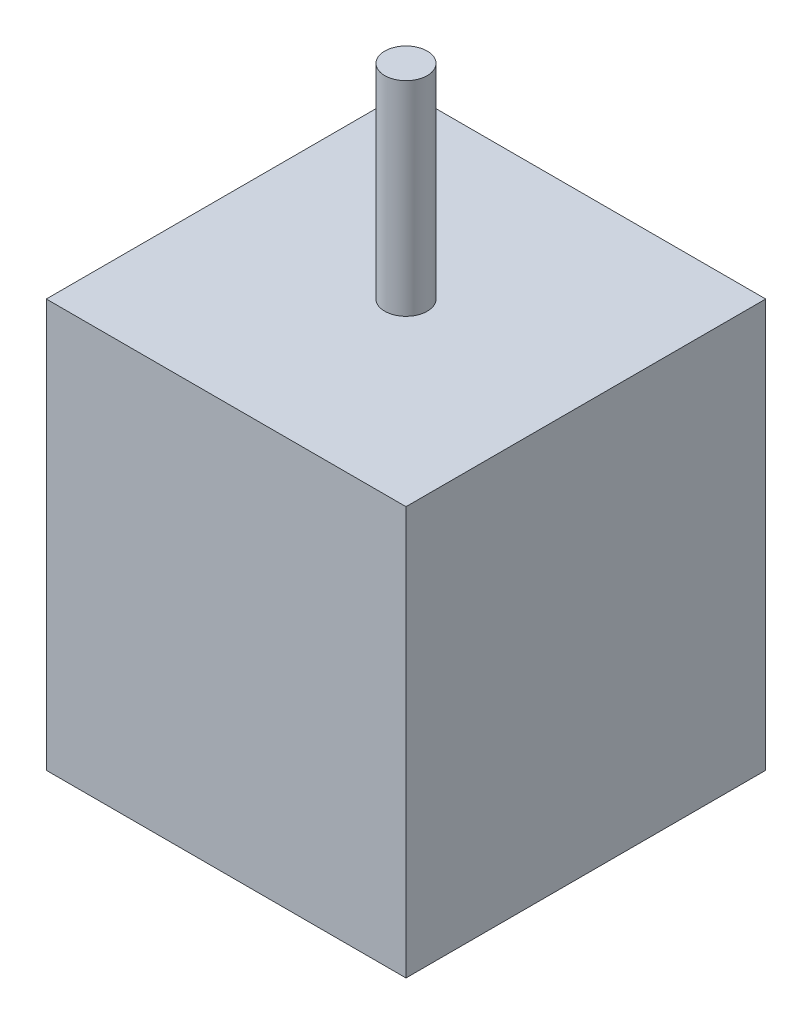
ISO-10303-21;
HEADER;
FILE_DESCRIPTION(('STEP AP214'),'2;1');
FILE_NAME('part.step','',(''),(''),'','','');
FILE_SCHEMA(('AUTOMOTIVE_DESIGN { 1 0 10303 214 1 1 1 1 }'));
ENDSEC;
DATA;
#1=APPLICATION_CONTEXT('core data for automotive mechanical design processes');
#2=APPLICATION_PROTOCOL_DEFINITION('international standard','automotive_design',2000,#1);
#3=PRODUCT_CONTEXT('',#1,'mechanical');
#4=PRODUCT('Part','Part','',(#3));
#5=PRODUCT_RELATED_PRODUCT_CATEGORY('part','',(#4));
#6=PRODUCT_DEFINITION_FORMATION('','',#4);
#7=PRODUCT_DEFINITION_CONTEXT('part definition',#1,'design');
#8=PRODUCT_DEFINITION('design','',#6,#7);
#9=PRODUCT_DEFINITION_SHAPE('','',#8);
#10=(LENGTH_UNIT() NAMED_UNIT(*) SI_UNIT(.MILLI.,.METRE.));
#11=(NAMED_UNIT(*) PLANE_ANGLE_UNIT() SI_UNIT($,.RADIAN.));
#12=(NAMED_UNIT(*) SI_UNIT($,.STERADIAN.) SOLID_ANGLE_UNIT());
#13=UNCERTAINTY_MEASURE_WITH_UNIT(LENGTH_MEASURE(1.E-05),#10,'distance_accuracy_value','');
#14=(GEOMETRIC_REPRESENTATION_CONTEXT(3) GLOBAL_UNCERTAINTY_ASSIGNED_CONTEXT((#13)) GLOBAL_UNIT_ASSIGNED_CONTEXT((#10,
#11,#12)) REPRESENTATION_CONTEXT('',''));
#15=CARTESIAN_POINT('',(0.,0.,0.));
#16=DIRECTION('',(0.,0.,1.));
#17=DIRECTION('',(1.,0.,0.));
#18=AXIS2_PLACEMENT_3D('',#15,#16,#17);
#19=CARTESIAN_POINT('',(0.,24.,0.));
#20=DIRECTION('',(0.,-1.,0.));
#21=DIRECTION('',(0.,0.,-1.));
#22=AXIS2_PLACEMENT_3D('',#19,#20,#21);
#23=CYLINDRICAL_SURFACE('',#22,2.5);
#24=CARTESIAN_POINT('',(0.,24.,0.));
#25=DIRECTION('',(0.,1.,0.));
#26=DIRECTION('',(0.,0.,1.));
#27=AXIS2_PLACEMENT_3D('',#24,#25,#26);
#28=CIRCLE('',#27,2.5);
#29=CARTESIAN_POINT('',(0.,24.,2.5));
#30=VERTEX_POINT('',#29);
#31=EDGE_CURVE('E11',#30,#30,#28,.T.);
#32=ORIENTED_EDGE('',*,*,#31,.F.);
#33=EDGE_LOOP('',(#32));
#34=FACE_BOUND('',#33,.T.);
#35=CARTESIAN_POINT('',(0.,0.,0.));
#36=DIRECTION('',(0.,-1.,0.));
#37=DIRECTION('',(0.,0.,-1.));
#38=AXIS2_PLACEMENT_3D('',#35,#36,#37);
#39=CIRCLE('',#38,2.5);
#40=CARTESIAN_POINT('',(0.,0.,-2.5));
#41=VERTEX_POINT('',#40);
#42=EDGE_CURVE('E40',#41,#41,#39,.T.);
#43=ORIENTED_EDGE('',*,*,#42,.F.);
#44=EDGE_LOOP('',(#43));
#45=FACE_BOUND('',#44,.T.);
#46=ADVANCED_FACE('F32',(#34,#45),#23,.T.);
#47=CARTESIAN_POINT('',(0.,24.,0.));
#48=DIRECTION('',(0.,1.,0.));
#49=DIRECTION('',(0.,0.,1.));
#50=AXIS2_PLACEMENT_3D('',#47,#48,#49);
#51=PLANE('',#50);
#52=ORIENTED_EDGE('',*,*,#31,.T.);
#53=EDGE_LOOP('',(#52));
#54=FACE_BOUND('',#53,.T.);
#55=ADVANCED_FACE('F116',(#54),#51,.T.);
#56=CARTESIAN_POINT('',(21.15,-48.,21.15));
#57=DIRECTION('',(1.,0.,0.));
#58=DIRECTION('',(0.,0.,-1.));
#59=AXIS2_PLACEMENT_3D('',#56,#57,#58);
#60=PLANE('',#59);
#61=DIRECTION('',(0.,0.,-1.));
#62=VECTOR('',#61,1.);
#63=CARTESIAN_POINT('',(21.15,0.,21.15));
#64=LINE('',#63,#62);
#65=CARTESIAN_POINT('',(21.15,0.,21.15));
#66=VERTEX_POINT('',#65);
#67=CARTESIAN_POINT('',(21.15,0.,-21.15));
#68=VERTEX_POINT('',#67);
#69=EDGE_CURVE('E99',#66,#68,#64,.T.);
#70=ORIENTED_EDGE('',*,*,#69,.F.);
#71=DIRECTION('',(0.,1.,0.));
#72=VECTOR('',#71,1.);
#73=CARTESIAN_POINT('',(21.15,-48.,21.15));
#74=LINE('',#73,#72);
#75=CARTESIAN_POINT('',(21.15,-48.,21.15));
#76=VERTEX_POINT('',#75);
#77=EDGE_CURVE('E48',#76,#66,#74,.T.);
#78=ORIENTED_EDGE('',*,*,#77,.F.);
#79=DIRECTION('',(0.,0.,-1.));
#80=VECTOR('',#79,1.);
#81=CARTESIAN_POINT('',(21.15,-48.,21.15));
#82=LINE('',#81,#80);
#83=CARTESIAN_POINT('',(21.15,-48.,-21.15));
#84=VERTEX_POINT('',#83);
#85=EDGE_CURVE('E93',#76,#84,#82,.T.);
#86=ORIENTED_EDGE('',*,*,#85,.T.);
#87=DIRECTION('',(0.,1.,0.));
#88=VECTOR('',#87,1.);
#89=CARTESIAN_POINT('',(21.15,-48.,-21.15));
#90=LINE('',#89,#88);
#91=EDGE_CURVE('E76',#84,#68,#90,.T.);
#92=ORIENTED_EDGE('',*,*,#91,.T.);
#93=EDGE_LOOP('',(#70,#78,#86,#92));
#94=FACE_BOUND('',#93,.T.);
#95=ADVANCED_FACE('F121',(#94),#60,.T.);
#96=CARTESIAN_POINT('',(-21.15,-48.,21.15));
#97=DIRECTION('',(0.,0.,1.));
#98=DIRECTION('',(1.,0.,0.));
#99=AXIS2_PLACEMENT_3D('',#96,#97,#98);
#100=PLANE('',#99);
#101=DIRECTION('',(1.,0.,0.));
#102=VECTOR('',#101,1.);
#103=CARTESIAN_POINT('',(-21.15,0.,21.15));
#104=LINE('',#103,#102);
#105=CARTESIAN_POINT('',(-21.15,0.,21.15));
#106=VERTEX_POINT('',#105);
#107=EDGE_CURVE('E95',#106,#66,#104,.T.);
#108=ORIENTED_EDGE('',*,*,#107,.F.);
#109=DIRECTION('',(0.,1.,0.));
#110=VECTOR('',#109,1.);
#111=CARTESIAN_POINT('',(-21.15,-48.,21.15));
#112=LINE('',#111,#110);
#113=CARTESIAN_POINT('',(-21.15,-48.,21.15));
#114=VERTEX_POINT('',#113);
#115=EDGE_CURVE('E65',#114,#106,#112,.T.);
#116=ORIENTED_EDGE('',*,*,#115,.F.);
#117=DIRECTION('',(1.,0.,0.));
#118=VECTOR('',#117,1.);
#119=CARTESIAN_POINT('',(-21.15,-48.,21.15));
#120=LINE('',#119,#118);
#121=EDGE_CURVE('E90',#114,#76,#120,.T.);
#122=ORIENTED_EDGE('',*,*,#121,.T.);
#123=ORIENTED_EDGE('',*,*,#77,.T.);
#124=EDGE_LOOP('',(#108,#116,#122,#123));
#125=FACE_BOUND('',#124,.T.);
#126=ADVANCED_FACE('F127',(#125),#100,.T.);
#127=CARTESIAN_POINT('',(-21.15,-48.,21.15));
#128=DIRECTION('',(-1.,0.,0.));
#129=DIRECTION('',(0.,0.,1.));
#130=AXIS2_PLACEMENT_3D('',#127,#128,#129);
#131=PLANE('',#130);
#132=DIRECTION('',(0.,0.,1.));
#133=VECTOR('',#132,1.);
#134=CARTESIAN_POINT('',(-21.15,0.,21.15));
#135=LINE('',#134,#133);
#136=CARTESIAN_POINT('',(-21.15,0.,-21.15));
#137=VERTEX_POINT('',#136);
#138=EDGE_CURVE('E84',#137,#106,#135,.T.);
#139=ORIENTED_EDGE('',*,*,#138,.F.);
#140=DIRECTION('',(0.,1.,0.));
#141=VECTOR('',#140,1.);
#142=CARTESIAN_POINT('',(-21.15,-48.,-21.15));
#143=LINE('',#142,#141);
#144=CARTESIAN_POINT('',(-21.15,-48.,-21.15));
#145=VERTEX_POINT('',#144);
#146=EDGE_CURVE('E79',#145,#137,#143,.T.);
#147=ORIENTED_EDGE('',*,*,#146,.F.);
#148=DIRECTION('',(0.,0.,1.));
#149=VECTOR('',#148,1.);
#150=CARTESIAN_POINT('',(-21.15,-48.,21.15));
#151=LINE('',#150,#149);
#152=EDGE_CURVE('E82',#145,#114,#151,.T.);
#153=ORIENTED_EDGE('',*,*,#152,.T.);
#154=ORIENTED_EDGE('',*,*,#115,.T.);
#155=EDGE_LOOP('',(#139,#147,#153,#154));
#156=FACE_BOUND('',#155,.T.);
#157=ADVANCED_FACE('F81',(#156),#131,.T.);
#158=CARTESIAN_POINT('',(-21.15,-48.,-21.15));
#159=DIRECTION('',(0.,0.,-1.));
#160=DIRECTION('',(-1.,0.,0.));
#161=AXIS2_PLACEMENT_3D('',#158,#159,#160);
#162=PLANE('',#161);
#163=DIRECTION('',(-1.,0.,0.));
#164=VECTOR('',#163,1.);
#165=CARTESIAN_POINT('',(-21.15,0.,-21.15));
#166=LINE('',#165,#164);
#167=EDGE_CURVE('E102',#68,#137,#166,.T.);
#168=ORIENTED_EDGE('',*,*,#167,.F.);
#169=ORIENTED_EDGE('',*,*,#91,.F.);
#170=DIRECTION('',(-1.,0.,0.));
#171=VECTOR('',#170,1.);
#172=CARTESIAN_POINT('',(-21.15,-48.,-21.15));
#173=LINE('',#172,#171);
#174=EDGE_CURVE('E89',#84,#145,#173,.T.);
#175=ORIENTED_EDGE('',*,*,#174,.T.);
#176=ORIENTED_EDGE('',*,*,#146,.T.);
#177=EDGE_LOOP('',(#168,#169,#175,#176));
#178=FACE_BOUND('',#177,.T.);
#179=ADVANCED_FACE('F92',(#178),#162,.T.);
#180=CARTESIAN_POINT('',(0.,-48.,0.));
#181=DIRECTION('',(0.,-1.,0.));
#182=DIRECTION('',(0.,0.,-1.));
#183=AXIS2_PLACEMENT_3D('',#180,#181,#182);
#184=PLANE('',#183);
#185=ORIENTED_EDGE('',*,*,#85,.F.);
#186=ORIENTED_EDGE('',*,*,#121,.F.);
#187=ORIENTED_EDGE('',*,*,#152,.F.);
#188=ORIENTED_EDGE('',*,*,#174,.F.);
#189=EDGE_LOOP('',(#185,#186,#187,#188));
#190=FACE_BOUND('',#189,.T.);
#191=ADVANCED_FACE('F88',(#190),#184,.T.);
#192=CARTESIAN_POINT('',(0.,0.,0.));
#193=DIRECTION('',(0.,-1.,0.));
#194=DIRECTION('',(0.,0.,-1.));
#195=AXIS2_PLACEMENT_3D('',#192,#193,#194);
#196=PLANE('',#195);
#197=ORIENTED_EDGE('',*,*,#42,.T.);
#198=EDGE_LOOP('',(#197));
#199=FACE_BOUND('',#198,.T.);
#200=ORIENTED_EDGE('',*,*,#69,.T.);
#201=ORIENTED_EDGE('',*,*,#167,.T.);
#202=ORIENTED_EDGE('',*,*,#138,.T.);
#203=ORIENTED_EDGE('',*,*,#107,.T.);
#204=EDGE_LOOP('',(#200,#201,#202,#203));
#205=FACE_BOUND('',#204,.T.);
#206=ADVANCED_FACE('F112',(#199,#205),#196,.F.);
#207=CLOSED_SHELL('',(#46,#55,#95,#126,#157,#179,#191,#206));
#208=MANIFOLD_SOLID_BREP('B2',#207);
#209=ADVANCED_BREP_SHAPE_REPRESENTATION('',(#18,#208),#14);
#210=SHAPE_DEFINITION_REPRESENTATION(#9,#209);
ENDSEC;
END-ISO-10303-21;
